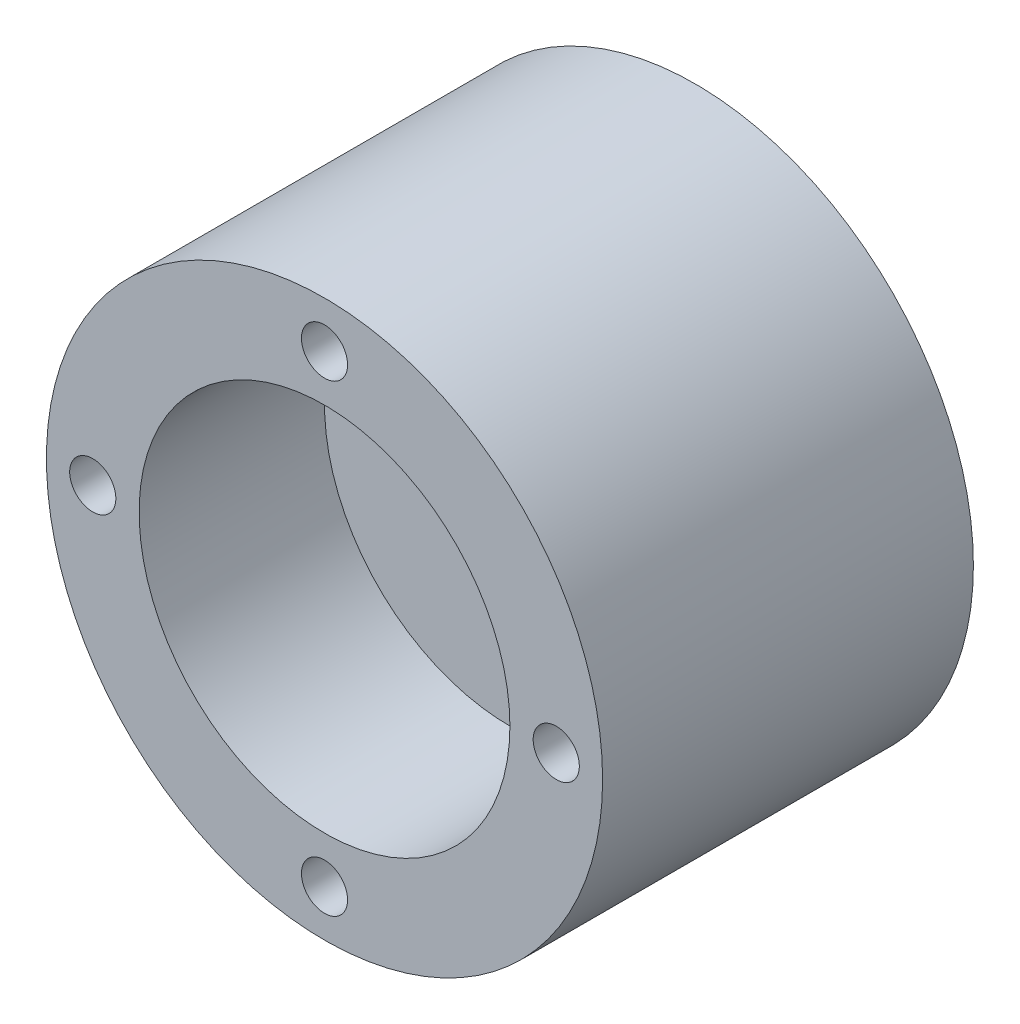
ISO-10303-21;
HEADER;
FILE_DESCRIPTION(('STEP AP214'),'2;1');
FILE_NAME('part.step','',(''),(''),'','','');
FILE_SCHEMA(('AUTOMOTIVE_DESIGN { 1 0 10303 214 1 1 1 1 }'));
ENDSEC;
DATA;
#1=APPLICATION_CONTEXT('core data for automotive mechanical design processes');
#2=APPLICATION_PROTOCOL_DEFINITION('international standard','automotive_design',2000,#1);
#3=PRODUCT_CONTEXT('',#1,'mechanical');
#4=PRODUCT('Part','Part','',(#3));
#5=PRODUCT_RELATED_PRODUCT_CATEGORY('part','',(#4));
#6=PRODUCT_DEFINITION_FORMATION('','',#4);
#7=PRODUCT_DEFINITION_CONTEXT('part definition',#1,'design');
#8=PRODUCT_DEFINITION('design','',#6,#7);
#9=PRODUCT_DEFINITION_SHAPE('','',#8);
#10=(LENGTH_UNIT() NAMED_UNIT(*) SI_UNIT(.MILLI.,.METRE.));
#11=(NAMED_UNIT(*) PLANE_ANGLE_UNIT() SI_UNIT($,.RADIAN.));
#12=(NAMED_UNIT(*) SI_UNIT($,.STERADIAN.) SOLID_ANGLE_UNIT());
#13=UNCERTAINTY_MEASURE_WITH_UNIT(LENGTH_MEASURE(1.E-05),#10,'distance_accuracy_value','');
#14=(GEOMETRIC_REPRESENTATION_CONTEXT(3) GLOBAL_UNCERTAINTY_ASSIGNED_CONTEXT((#13)) GLOBAL_UNIT_ASSIGNED_CONTEXT((#10,
#11,#12)) REPRESENTATION_CONTEXT('',''));
#15=CARTESIAN_POINT('',(0.,0.,0.));
#16=DIRECTION('',(0.,0.,1.));
#17=DIRECTION('',(1.,0.,0.));
#18=AXIS2_PLACEMENT_3D('',#15,#16,#17);
#19=CARTESIAN_POINT('',(0.,0.,0.));
#20=DIRECTION('',(0.,0.,1.));
#21=DIRECTION('',(1.,0.,0.));
#22=AXIS2_PLACEMENT_3D('',#19,#20,#21);
#23=CYLINDRICAL_SURFACE('',#22,7.9375);
#24=CARTESIAN_POINT('',(0.,0.,0.));
#25=DIRECTION('',(0.,0.,1.));
#26=DIRECTION('',(1.,0.,0.));
#27=AXIS2_PLACEMENT_3D('',#24,#25,#26);
#28=CIRCLE('',#27,7.9375);
#29=CARTESIAN_POINT('',(7.9375,0.,0.));
#30=VERTEX_POINT('',#29);
#31=EDGE_CURVE('E44',#30,#30,#28,.T.);
#32=ORIENTED_EDGE('',*,*,#31,.F.);
#33=EDGE_LOOP('',(#32));
#34=FACE_BOUND('',#33,.T.);
#35=CARTESIAN_POINT('',(0.,0.,25.4));
#36=DIRECTION('',(0.,0.,1.));
#37=DIRECTION('',(1.,0.,0.));
#38=AXIS2_PLACEMENT_3D('',#35,#36,#37);
#39=CIRCLE('',#38,7.9375);
#40=CARTESIAN_POINT('',(7.9375,0.,25.4));
#41=VERTEX_POINT('',#40);
#42=EDGE_CURVE('E35',#41,#41,#39,.F.);
#43=ORIENTED_EDGE('',*,*,#42,.F.);
#44=EDGE_LOOP('',(#43));
#45=FACE_BOUND('',#44,.T.);
#46=ADVANCED_FACE('F31',(#34,#45),#23,.F.);
#47=CARTESIAN_POINT('',(0.,0.,50.8));
#48=DIRECTION('',(0.,0.,-1.));
#49=DIRECTION('',(-1.,0.,0.));
#50=AXIS2_PLACEMENT_3D('',#47,#48,#49);
#51=CYLINDRICAL_SURFACE('',#50,38.1);
#52=CARTESIAN_POINT('',(0.,0.,50.8));
#53=DIRECTION('',(0.,0.,1.));
#54=DIRECTION('',(1.,0.,0.));
#55=AXIS2_PLACEMENT_3D('',#52,#53,#54);
#56=CIRCLE('',#55,38.1);
#57=CARTESIAN_POINT('',(38.1,0.,50.8));
#58=VERTEX_POINT('',#57);
#59=EDGE_CURVE('E10',#58,#58,#56,.T.);
#60=ORIENTED_EDGE('',*,*,#59,.F.);
#61=EDGE_LOOP('',(#60));
#62=FACE_BOUND('',#61,.T.);
#63=CARTESIAN_POINT('',(0.,0.,0.));
#64=DIRECTION('',(0.,0.,1.));
#65=DIRECTION('',(1.,0.,0.));
#66=AXIS2_PLACEMENT_3D('',#63,#64,#65);
#67=CIRCLE('',#66,38.1);
#68=CARTESIAN_POINT('',(38.1,0.,0.));
#69=VERTEX_POINT('',#68);
#70=EDGE_CURVE('E39',#69,#69,#67,.T.);
#71=ORIENTED_EDGE('',*,*,#70,.T.);
#72=EDGE_LOOP('',(#71));
#73=FACE_BOUND('',#72,.T.);
#74=ADVANCED_FACE('F33',(#62,#73),#51,.T.);
#75=CARTESIAN_POINT('',(0.,0.,50.8));
#76=DIRECTION('',(0.,0.,1.));
#77=DIRECTION('',(1.,0.,0.));
#78=AXIS2_PLACEMENT_3D('',#75,#76,#77);
#79=PLANE('',#78);
#80=CARTESIAN_POINT('',(0.,0.,50.8));
#81=DIRECTION('',(0.,0.,1.));
#82=DIRECTION('',(1.,0.,0.));
#83=AXIS2_PLACEMENT_3D('',#80,#81,#82);
#84=CIRCLE('',#83,25.4);
#85=CARTESIAN_POINT('',(25.4,0.,50.8));
#86=VERTEX_POINT('',#85);
#87=EDGE_CURVE('E72',#86,#86,#84,.T.);
#88=ORIENTED_EDGE('',*,*,#87,.F.);
#89=EDGE_LOOP('',(#88));
#90=FACE_BOUND('',#89,.T.);
#91=CARTESIAN_POINT('',(-31.75,0.,50.8));
#92=DIRECTION('',(0.,0.,1.));
#93=DIRECTION('',(1.,0.,0.));
#94=AXIS2_PLACEMENT_3D('',#91,#92,#93);
#95=CIRCLE('',#94,3.1623);
#96=CARTESIAN_POINT('',(-28.5877,0.,50.8));
#97=VERTEX_POINT('',#96);
#98=EDGE_CURVE('E67',#97,#97,#95,.T.);
#99=ORIENTED_EDGE('',*,*,#98,.F.);
#100=EDGE_LOOP('',(#99));
#101=FACE_BOUND('',#100,.T.);
#102=CARTESIAN_POINT('',(31.75,0.,50.8));
#103=DIRECTION('',(0.,0.,1.));
#104=DIRECTION('',(1.,0.,0.));
#105=AXIS2_PLACEMENT_3D('',#102,#103,#104);
#106=CIRCLE('',#105,3.1623);
#107=CARTESIAN_POINT('',(34.9123,0.,50.8));
#108=VERTEX_POINT('',#107);
#109=EDGE_CURVE('E61',#108,#108,#106,.T.);
#110=ORIENTED_EDGE('',*,*,#109,.F.);
#111=EDGE_LOOP('',(#110));
#112=FACE_BOUND('',#111,.T.);
#113=CARTESIAN_POINT('',(0.,-31.75,50.8));
#114=DIRECTION('',(0.,0.,1.));
#115=DIRECTION('',(1.,0.,0.));
#116=AXIS2_PLACEMENT_3D('',#113,#114,#115);
#117=CIRCLE('',#116,3.1623);
#118=CARTESIAN_POINT('',(3.1623,-31.75,50.8));
#119=VERTEX_POINT('',#118);
#120=EDGE_CURVE('E55',#119,#119,#117,.T.);
#121=ORIENTED_EDGE('',*,*,#120,.F.);
#122=EDGE_LOOP('',(#121));
#123=FACE_BOUND('',#122,.T.);
#124=CARTESIAN_POINT('',(0.,31.75,50.8));
#125=DIRECTION('',(0.,0.,1.));
#126=DIRECTION('',(1.,0.,0.));
#127=AXIS2_PLACEMENT_3D('',#124,#125,#126);
#128=CIRCLE('',#127,3.1623);
#129=CARTESIAN_POINT('',(3.1623,31.75,50.8));
#130=VERTEX_POINT('',#129);
#131=EDGE_CURVE('E49',#130,#130,#128,.T.);
#132=ORIENTED_EDGE('',*,*,#131,.F.);
#133=EDGE_LOOP('',(#132));
#134=FACE_BOUND('',#133,.T.);
#135=ORIENTED_EDGE('',*,*,#59,.T.);
#136=EDGE_LOOP('',(#135));
#137=FACE_BOUND('',#136,.T.);
#138=ADVANCED_FACE('F90',(#90,#101,#112,#123,#134,#137),#79,.T.);
#139=CARTESIAN_POINT('',(0.,0.,0.));
#140=DIRECTION('',(0.,0.,1.));
#141=DIRECTION('',(1.,0.,0.));
#142=AXIS2_PLACEMENT_3D('',#139,#140,#141);
#143=PLANE('',#142);
#144=CARTESIAN_POINT('',(-31.75,0.,0.));
#145=DIRECTION('',(0.,0.,1.));
#146=DIRECTION('',(1.,0.,0.));
#147=AXIS2_PLACEMENT_3D('',#144,#145,#146);
#148=CIRCLE('',#147,3.1623);
#149=CARTESIAN_POINT('',(-28.5877,0.,0.));
#150=VERTEX_POINT('',#149);
#151=EDGE_CURVE('E64',#150,#150,#148,.T.);
#152=ORIENTED_EDGE('',*,*,#151,.T.);
#153=EDGE_LOOP('',(#152));
#154=FACE_BOUND('',#153,.T.);
#155=CARTESIAN_POINT('',(31.75,0.,0.));
#156=DIRECTION('',(0.,0.,1.));
#157=DIRECTION('',(1.,0.,0.));
#158=AXIS2_PLACEMENT_3D('',#155,#156,#157);
#159=CIRCLE('',#158,3.1623);
#160=CARTESIAN_POINT('',(34.9123,0.,0.));
#161=VERTEX_POINT('',#160);
#162=EDGE_CURVE('E58',#161,#161,#159,.T.);
#163=ORIENTED_EDGE('',*,*,#162,.T.);
#164=EDGE_LOOP('',(#163));
#165=FACE_BOUND('',#164,.T.);
#166=CARTESIAN_POINT('',(0.,-31.75,0.));
#167=DIRECTION('',(0.,0.,1.));
#168=DIRECTION('',(1.,0.,0.));
#169=AXIS2_PLACEMENT_3D('',#166,#167,#168);
#170=CIRCLE('',#169,3.1623);
#171=CARTESIAN_POINT('',(3.1623,-31.75,0.));
#172=VERTEX_POINT('',#171);
#173=EDGE_CURVE('E52',#172,#172,#170,.T.);
#174=ORIENTED_EDGE('',*,*,#173,.T.);
#175=EDGE_LOOP('',(#174));
#176=FACE_BOUND('',#175,.T.);
#177=CARTESIAN_POINT('',(0.,31.75,0.));
#178=DIRECTION('',(0.,0.,1.));
#179=DIRECTION('',(1.,0.,0.));
#180=AXIS2_PLACEMENT_3D('',#177,#178,#179);
#181=CIRCLE('',#180,3.1623);
#182=CARTESIAN_POINT('',(3.1623,31.75,0.));
#183=VERTEX_POINT('',#182);
#184=EDGE_CURVE('E48',#183,#183,#181,.T.);
#185=ORIENTED_EDGE('',*,*,#184,.T.);
#186=EDGE_LOOP('',(#185));
#187=FACE_BOUND('',#186,.T.);
#188=ORIENTED_EDGE('',*,*,#31,.T.);
#189=EDGE_LOOP('',(#188));
#190=FACE_BOUND('',#189,.T.);
#191=ORIENTED_EDGE('',*,*,#70,.F.);
#192=EDGE_LOOP('',(#191));
#193=FACE_BOUND('',#192,.T.);
#194=ADVANCED_FACE('F98',(#154,#165,#176,#187,#190,#193),#143,.F.);
#195=CARTESIAN_POINT('',(0.,31.75,0.));
#196=DIRECTION('',(0.,0.,1.));
#197=DIRECTION('',(1.,0.,0.));
#198=AXIS2_PLACEMENT_3D('',#195,#196,#197);
#199=CYLINDRICAL_SURFACE('',#198,3.1623);
#200=ORIENTED_EDGE('',*,*,#184,.F.);
#201=EDGE_LOOP('',(#200));
#202=FACE_BOUND('',#201,.T.);
#203=ORIENTED_EDGE('',*,*,#131,.T.);
#204=EDGE_LOOP('',(#203));
#205=FACE_BOUND('',#204,.T.);
#206=ADVANCED_FACE('F95',(#202,#205),#199,.F.);
#207=CARTESIAN_POINT('',(0.,-31.75,0.));
#208=DIRECTION('',(0.,0.,1.));
#209=DIRECTION('',(1.,0.,0.));
#210=AXIS2_PLACEMENT_3D('',#207,#208,#209);
#211=CYLINDRICAL_SURFACE('',#210,3.1623);
#212=ORIENTED_EDGE('',*,*,#173,.F.);
#213=EDGE_LOOP('',(#212));
#214=FACE_BOUND('',#213,.T.);
#215=ORIENTED_EDGE('',*,*,#120,.T.);
#216=EDGE_LOOP('',(#215));
#217=FACE_BOUND('',#216,.T.);
#218=ADVANCED_FACE('F105',(#214,#217),#211,.F.);
#219=CARTESIAN_POINT('',(31.75,0.,0.));
#220=DIRECTION('',(0.,0.,1.));
#221=DIRECTION('',(1.,0.,0.));
#222=AXIS2_PLACEMENT_3D('',#219,#220,#221);
#223=CYLINDRICAL_SURFACE('',#222,3.1623);
#224=ORIENTED_EDGE('',*,*,#162,.F.);
#225=EDGE_LOOP('',(#224));
#226=FACE_BOUND('',#225,.T.);
#227=ORIENTED_EDGE('',*,*,#109,.T.);
#228=EDGE_LOOP('',(#227));
#229=FACE_BOUND('',#228,.T.);
#230=ADVANCED_FACE('F124',(#226,#229),#223,.F.);
#231=CARTESIAN_POINT('',(-31.75,0.,0.));
#232=DIRECTION('',(0.,0.,1.));
#233=DIRECTION('',(1.,0.,0.));
#234=AXIS2_PLACEMENT_3D('',#231,#232,#233);
#235=CYLINDRICAL_SURFACE('',#234,3.1623);
#236=ORIENTED_EDGE('',*,*,#151,.F.);
#237=EDGE_LOOP('',(#236));
#238=FACE_BOUND('',#237,.T.);
#239=ORIENTED_EDGE('',*,*,#98,.T.);
#240=EDGE_LOOP('',(#239));
#241=FACE_BOUND('',#240,.T.);
#242=ADVANCED_FACE('F130',(#238,#241),#235,.F.);
#243=CARTESIAN_POINT('',(0.,0.,25.4));
#244=DIRECTION('',(0.,0.,1.));
#245=DIRECTION('',(1.,0.,0.));
#246=AXIS2_PLACEMENT_3D('',#243,#244,#245);
#247=PLANE('',#246);
#248=CARTESIAN_POINT('',(0.,0.,25.4));
#249=DIRECTION('',(0.,0.,1.));
#250=DIRECTION('',(1.,0.,0.));
#251=AXIS2_PLACEMENT_3D('',#248,#249,#250);
#252=CIRCLE('',#251,25.4);
#253=CARTESIAN_POINT('',(25.4,0.,25.4));
#254=VERTEX_POINT('',#253);
#255=EDGE_CURVE('E75',#254,#254,#252,.T.);
#256=ORIENTED_EDGE('',*,*,#255,.T.);
#257=EDGE_LOOP('',(#256));
#258=FACE_BOUND('',#257,.T.);
#259=ORIENTED_EDGE('',*,*,#42,.T.);
#260=EDGE_LOOP('',(#259));
#261=FACE_BOUND('',#260,.T.);
#262=ADVANCED_FACE('F82',(#258,#261),#247,.T.);
#263=CARTESIAN_POINT('',(0.,0.,25.4));
#264=DIRECTION('',(0.,0.,1.));
#265=DIRECTION('',(1.,0.,0.));
#266=AXIS2_PLACEMENT_3D('',#263,#264,#265);
#267=CYLINDRICAL_SURFACE('',#266,25.4);
#268=ORIENTED_EDGE('',*,*,#255,.F.);
#269=EDGE_LOOP('',(#268));
#270=FACE_BOUND('',#269,.T.);
#271=ORIENTED_EDGE('',*,*,#87,.T.);
#272=EDGE_LOOP('',(#271));
#273=FACE_BOUND('',#272,.T.);
#274=ADVANCED_FACE('F137',(#270,#273),#267,.F.);
#275=CLOSED_SHELL('',(#46,#74,#138,#194,#206,#218,#230,#242,#262,#274));
#276=MANIFOLD_SOLID_BREP('B2',#275);
#277=ADVANCED_BREP_SHAPE_REPRESENTATION('',(#18,#276),#14);
#278=SHAPE_DEFINITION_REPRESENTATION(#9,#277);
ENDSEC;
END-ISO-10303-21;
